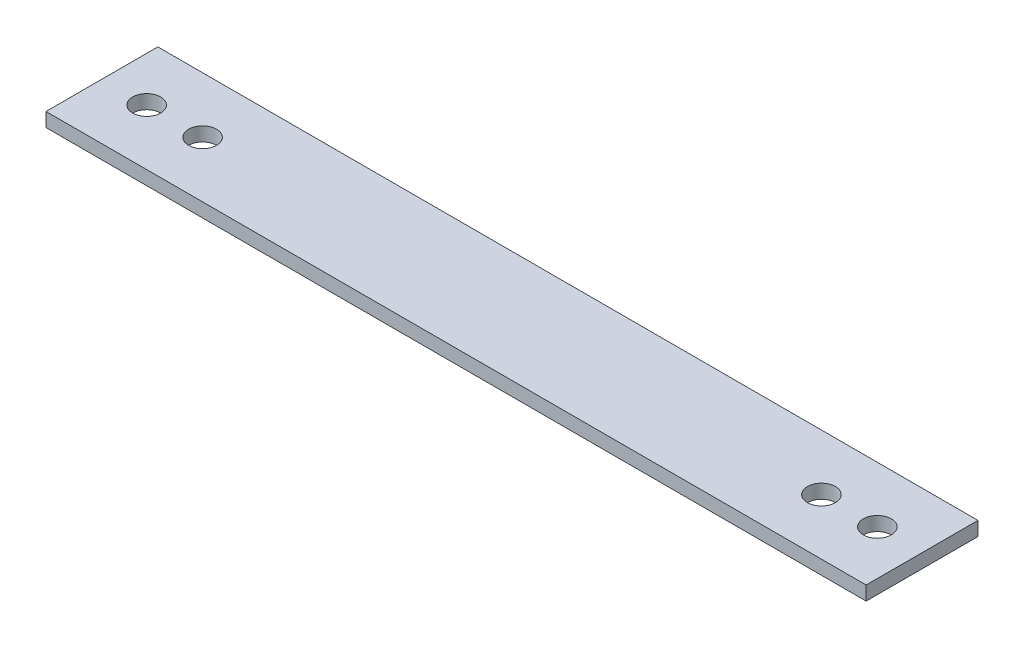
ISO-10303-21;
HEADER;
FILE_DESCRIPTION(('STEP AP214'),'2;1');
FILE_NAME('part.step','',(''),(''),'','','');
FILE_SCHEMA(('AUTOMOTIVE_DESIGN { 1 0 10303 214 1 1 1 1 }'));
ENDSEC;
DATA;
#1=APPLICATION_CONTEXT('core data for automotive mechanical design processes');
#2=APPLICATION_PROTOCOL_DEFINITION('international standard','automotive_design',2000,#1);
#3=PRODUCT_CONTEXT('',#1,'mechanical');
#4=PRODUCT('Part','Part','',(#3));
#5=PRODUCT_RELATED_PRODUCT_CATEGORY('part','',(#4));
#6=PRODUCT_DEFINITION_FORMATION('','',#4);
#7=PRODUCT_DEFINITION_CONTEXT('part definition',#1,'design');
#8=PRODUCT_DEFINITION('design','',#6,#7);
#9=PRODUCT_DEFINITION_SHAPE('','',#8);
#10=(LENGTH_UNIT() NAMED_UNIT(*) SI_UNIT(.MILLI.,.METRE.));
#11=(NAMED_UNIT(*) PLANE_ANGLE_UNIT() SI_UNIT($,.RADIAN.));
#12=(NAMED_UNIT(*) SI_UNIT($,.STERADIAN.) SOLID_ANGLE_UNIT());
#13=UNCERTAINTY_MEASURE_WITH_UNIT(LENGTH_MEASURE(1.E-05),#10,'distance_accuracy_value','');
#14=(GEOMETRIC_REPRESENTATION_CONTEXT(3) GLOBAL_UNCERTAINTY_ASSIGNED_CONTEXT((#13)) GLOBAL_UNIT_ASSIGNED_CONTEXT((#10,
#11,#12)) REPRESENTATION_CONTEXT('',''));
#15=CARTESIAN_POINT('',(0.,0.,0.));
#16=DIRECTION('',(0.,0.,1.));
#17=DIRECTION('',(1.,0.,0.));
#18=AXIS2_PLACEMENT_3D('',#15,#16,#17);
#19=CARTESIAN_POINT('',(0.,4.7625,0.));
#20=DIRECTION('',(0.,-1.,0.));
#21=DIRECTION('',(0.,0.,-1.));
#22=AXIS2_PLACEMENT_3D('',#19,#20,#21);
#23=PLANE('',#22);
#24=DIRECTION('',(0.,0.,-1.));
#25=VECTOR('',#24,1.);
#26=CARTESIAN_POINT('',(139.7,4.7625,19.05));
#27=LINE('',#26,#25);
#28=CARTESIAN_POINT('',(139.7,4.7625,19.05));
#29=VERTEX_POINT('',#28);
#30=CARTESIAN_POINT('',(139.7,4.7625,-19.05));
#31=VERTEX_POINT('',#30);
#32=EDGE_CURVE('E95',#29,#31,#27,.T.);
#33=ORIENTED_EDGE('',*,*,#32,.T.);
#34=DIRECTION('',(-1.,0.,0.));
#35=VECTOR('',#34,1.);
#36=CARTESIAN_POINT('',(-139.7,4.7625,-19.05));
#37=LINE('',#36,#35);
#38=CARTESIAN_POINT('',(-139.7,4.7625,-19.05));
#39=VERTEX_POINT('',#38);
#40=EDGE_CURVE('E90',#31,#39,#37,.T.);
#41=ORIENTED_EDGE('',*,*,#40,.T.);
#42=DIRECTION('',(0.,0.,1.));
#43=VECTOR('',#42,1.);
#44=CARTESIAN_POINT('',(-139.7,4.7625,19.05));
#45=LINE('',#44,#43);
#46=CARTESIAN_POINT('',(-139.7,4.7625,19.05));
#47=VERTEX_POINT('',#46);
#48=EDGE_CURVE('E93',#39,#47,#45,.T.);
#49=ORIENTED_EDGE('',*,*,#48,.T.);
#50=DIRECTION('',(1.,0.,0.));
#51=VECTOR('',#50,1.);
#52=CARTESIAN_POINT('',(-139.7,4.7625,19.05));
#53=LINE('',#52,#51);
#54=EDGE_CURVE('E60',#47,#29,#53,.T.);
#55=ORIENTED_EDGE('',*,*,#54,.T.);
#56=EDGE_LOOP('',(#33,#41,#49,#55));
#57=FACE_BOUND('',#56,.T.);
#58=CARTESIAN_POINT('',(-124.46,4.7625,0.));
#59=DIRECTION('',(0.,1.,0.));
#60=DIRECTION('',(0.,0.,1.));
#61=AXIS2_PLACEMENT_3D('',#58,#59,#60);
#62=CIRCLE('',#61,4.7625);
#63=CARTESIAN_POINT('',(-124.46,4.7625,-4.7625));
#64=VERTEX_POINT('',#63);
#65=EDGE_CURVE('E115',#64,#64,#62,.T.);
#66=ORIENTED_EDGE('',*,*,#65,.F.);
#67=EDGE_LOOP('',(#66));
#68=FACE_BOUND('',#67,.T.);
#69=CARTESIAN_POINT('',(-105.41,4.7625,0.));
#70=DIRECTION('',(0.,1.,0.));
#71=DIRECTION('',(0.,0.,1.));
#72=AXIS2_PLACEMENT_3D('',#69,#70,#71);
#73=CIRCLE('',#72,4.7625);
#74=CARTESIAN_POINT('',(-105.41,4.7625,-4.7625));
#75=VERTEX_POINT('',#74);
#76=EDGE_CURVE('E137',#75,#75,#73,.T.);
#77=ORIENTED_EDGE('',*,*,#76,.F.);
#78=EDGE_LOOP('',(#77));
#79=FACE_BOUND('',#78,.T.);
#80=CARTESIAN_POINT('',(124.46,4.7625,0.));
#81=DIRECTION('',(0.,1.,0.));
#82=DIRECTION('',(0.,0.,-1.));
#83=AXIS2_PLACEMENT_3D('',#80,#81,#82);
#84=CIRCLE('',#83,4.76250000000001);
#85=CARTESIAN_POINT('',(124.46,4.7625,-4.76250000000004));
#86=VERTEX_POINT('',#85);
#87=EDGE_CURVE('E145',#86,#86,#84,.T.);
#88=ORIENTED_EDGE('',*,*,#87,.F.);
#89=EDGE_LOOP('',(#88));
#90=FACE_BOUND('',#89,.T.);
#91=CARTESIAN_POINT('',(105.41,4.7625,0.));
#92=DIRECTION('',(0.,1.,0.));
#93=DIRECTION('',(0.,0.,-1.));
#94=AXIS2_PLACEMENT_3D('',#91,#92,#93);
#95=CIRCLE('',#94,4.7625);
#96=CARTESIAN_POINT('',(105.41,4.7625,-4.76250000000002));
#97=VERTEX_POINT('',#96);
#98=EDGE_CURVE('E153',#97,#97,#95,.T.);
#99=ORIENTED_EDGE('',*,*,#98,.F.);
#100=EDGE_LOOP('',(#99));
#101=FACE_BOUND('',#100,.T.);
#102=ADVANCED_FACE('F42',(#57,#68,#79,#90,#101),#23,.F.);
#103=CARTESIAN_POINT('',(0.,0.,0.));
#104=DIRECTION('',(0.,-1.,0.));
#105=DIRECTION('',(0.,0.,-1.));
#106=AXIS2_PLACEMENT_3D('',#103,#104,#105);
#107=PLANE('',#106);
#108=CARTESIAN_POINT('',(124.46,0.,0.));
#109=DIRECTION('',(0.,1.,0.));
#110=DIRECTION('',(0.,0.,-1.));
#111=AXIS2_PLACEMENT_3D('',#108,#109,#110);
#112=CIRCLE('',#111,4.76250000000001);
#113=CARTESIAN_POINT('',(124.46,0.,-4.76250000000004));
#114=VERTEX_POINT('',#113);
#115=EDGE_CURVE('E149',#114,#114,#112,.T.);
#116=ORIENTED_EDGE('',*,*,#115,.T.);
#117=EDGE_LOOP('',(#116));
#118=FACE_BOUND('',#117,.T.);
#119=CARTESIAN_POINT('',(-124.46,0.,0.));
#120=DIRECTION('',(0.,1.,0.));
#121=DIRECTION('',(0.,0.,1.));
#122=AXIS2_PLACEMENT_3D('',#119,#120,#121);
#123=CIRCLE('',#122,4.7625);
#124=CARTESIAN_POINT('',(-124.46,0.,-4.7625));
#125=VERTEX_POINT('',#124);
#126=EDGE_CURVE('E133',#125,#125,#123,.T.);
#127=ORIENTED_EDGE('',*,*,#126,.T.);
#128=EDGE_LOOP('',(#127));
#129=FACE_BOUND('',#128,.T.);
#130=DIRECTION('',(0.,0.,-1.));
#131=VECTOR('',#130,1.);
#132=CARTESIAN_POINT('',(139.7,0.,19.05));
#133=LINE('',#132,#131);
#134=CARTESIAN_POINT('',(139.7,0.,19.05));
#135=VERTEX_POINT('',#134);
#136=CARTESIAN_POINT('',(139.7,0.,-19.05));
#137=VERTEX_POINT('',#136);
#138=EDGE_CURVE('E111',#135,#137,#133,.T.);
#139=ORIENTED_EDGE('',*,*,#138,.F.);
#140=DIRECTION('',(1.,0.,0.));
#141=VECTOR('',#140,1.);
#142=CARTESIAN_POINT('',(-139.7,0.,19.05));
#143=LINE('',#142,#141);
#144=CARTESIAN_POINT('',(-139.7,0.,19.05));
#145=VERTEX_POINT('',#144);
#146=EDGE_CURVE('E83',#145,#135,#143,.T.);
#147=ORIENTED_EDGE('',*,*,#146,.F.);
#148=DIRECTION('',(0.,0.,1.));
#149=VECTOR('',#148,1.);
#150=CARTESIAN_POINT('',(-139.7,0.,19.05));
#151=LINE('',#150,#149);
#152=CARTESIAN_POINT('',(-139.7,0.,-19.05));
#153=VERTEX_POINT('',#152);
#154=EDGE_CURVE('E77',#153,#145,#151,.T.);
#155=ORIENTED_EDGE('',*,*,#154,.F.);
#156=DIRECTION('',(-1.,0.,0.));
#157=VECTOR('',#156,1.);
#158=CARTESIAN_POINT('',(-139.7,0.,-19.05));
#159=LINE('',#158,#157);
#160=EDGE_CURVE('E100',#137,#153,#159,.T.);
#161=ORIENTED_EDGE('',*,*,#160,.F.);
#162=EDGE_LOOP('',(#139,#147,#155,#161));
#163=FACE_BOUND('',#162,.T.);
#164=CARTESIAN_POINT('',(-105.41,0.,0.));
#165=DIRECTION('',(0.,1.,0.));
#166=DIRECTION('',(0.,0.,1.));
#167=AXIS2_PLACEMENT_3D('',#164,#165,#166);
#168=CIRCLE('',#167,4.7625);
#169=CARTESIAN_POINT('',(-105.41,0.,-4.7625));
#170=VERTEX_POINT('',#169);
#171=EDGE_CURVE('E141',#170,#170,#168,.T.);
#172=ORIENTED_EDGE('',*,*,#171,.T.);
#173=EDGE_LOOP('',(#172));
#174=FACE_BOUND('',#173,.T.);
#175=CARTESIAN_POINT('',(105.41,0.,0.));
#176=DIRECTION('',(0.,1.,0.));
#177=DIRECTION('',(0.,0.,-1.));
#178=AXIS2_PLACEMENT_3D('',#175,#176,#177);
#179=CIRCLE('',#178,4.7625);
#180=CARTESIAN_POINT('',(105.41,0.,-4.76250000000002));
#181=VERTEX_POINT('',#180);
#182=EDGE_CURVE('E157',#181,#181,#179,.T.);
#183=ORIENTED_EDGE('',*,*,#182,.T.);
#184=EDGE_LOOP('',(#183));
#185=FACE_BOUND('',#184,.T.);
#186=ADVANCED_FACE('F128',(#118,#129,#163,#174,#185),#107,.T.);
#187=CARTESIAN_POINT('',(139.7,4.7625,19.05));
#188=DIRECTION('',(-1.,0.,0.));
#189=DIRECTION('',(0.,0.,1.));
#190=AXIS2_PLACEMENT_3D('',#187,#188,#189);
#191=PLANE('',#190);
#192=ORIENTED_EDGE('',*,*,#138,.T.);
#193=DIRECTION('',(0.,-1.,0.));
#194=VECTOR('',#193,1.);
#195=CARTESIAN_POINT('',(139.7,4.7625,-19.05));
#196=LINE('',#195,#194);
#197=EDGE_CURVE('E11',#31,#137,#196,.T.);
#198=ORIENTED_EDGE('',*,*,#197,.F.);
#199=ORIENTED_EDGE('',*,*,#32,.F.);
#200=DIRECTION('',(0.,-1.,0.));
#201=VECTOR('',#200,1.);
#202=CARTESIAN_POINT('',(139.7,4.7625,19.05));
#203=LINE('',#202,#201);
#204=EDGE_CURVE('E107',#29,#135,#203,.T.);
#205=ORIENTED_EDGE('',*,*,#204,.T.);
#206=EDGE_LOOP('',(#192,#198,#199,#205));
#207=FACE_BOUND('',#206,.T.);
#208=ADVANCED_FACE('F44',(#207),#191,.F.);
#209=CARTESIAN_POINT('',(-139.7,4.7625,-19.05));
#210=DIRECTION('',(0.,0.,1.));
#211=DIRECTION('',(1.,0.,0.));
#212=AXIS2_PLACEMENT_3D('',#209,#210,#211);
#213=PLANE('',#212);
#214=ORIENTED_EDGE('',*,*,#160,.T.);
#215=DIRECTION('',(0.,-1.,0.));
#216=VECTOR('',#215,1.);
#217=CARTESIAN_POINT('',(-139.7,4.7625,-19.05));
#218=LINE('',#217,#216);
#219=EDGE_CURVE('E52',#39,#153,#218,.T.);
#220=ORIENTED_EDGE('',*,*,#219,.F.);
#221=ORIENTED_EDGE('',*,*,#40,.F.);
#222=ORIENTED_EDGE('',*,*,#197,.T.);
#223=EDGE_LOOP('',(#214,#220,#221,#222));
#224=FACE_BOUND('',#223,.T.);
#225=ADVANCED_FACE('F99',(#224),#213,.F.);
#226=CARTESIAN_POINT('',(-139.7,4.7625,19.05));
#227=DIRECTION('',(1.,0.,0.));
#228=DIRECTION('',(0.,0.,-1.));
#229=AXIS2_PLACEMENT_3D('',#226,#227,#228);
#230=PLANE('',#229);
#231=ORIENTED_EDGE('',*,*,#154,.T.);
#232=DIRECTION('',(0.,-1.,0.));
#233=VECTOR('',#232,1.);
#234=CARTESIAN_POINT('',(-139.7,4.7625,19.05));
#235=LINE('',#234,#233);
#236=EDGE_CURVE('E102',#47,#145,#235,.T.);
#237=ORIENTED_EDGE('',*,*,#236,.F.);
#238=ORIENTED_EDGE('',*,*,#48,.F.);
#239=ORIENTED_EDGE('',*,*,#219,.T.);
#240=EDGE_LOOP('',(#231,#237,#238,#239));
#241=FACE_BOUND('',#240,.T.);
#242=ADVANCED_FACE('F103',(#241),#230,.F.);
#243=CARTESIAN_POINT('',(-139.7,4.7625,19.05));
#244=DIRECTION('',(0.,0.,-1.));
#245=DIRECTION('',(-1.,0.,0.));
#246=AXIS2_PLACEMENT_3D('',#243,#244,#245);
#247=PLANE('',#246);
#248=ORIENTED_EDGE('',*,*,#146,.T.);
#249=ORIENTED_EDGE('',*,*,#204,.F.);
#250=ORIENTED_EDGE('',*,*,#54,.F.);
#251=ORIENTED_EDGE('',*,*,#236,.T.);
#252=EDGE_LOOP('',(#248,#249,#250,#251));
#253=FACE_BOUND('',#252,.T.);
#254=ADVANCED_FACE('F125',(#253),#247,.F.);
#255=CARTESIAN_POINT('',(-124.46,4.7625,0.));
#256=DIRECTION('',(0.,-1.,0.));
#257=DIRECTION('',(0.,0.,-1.));
#258=AXIS2_PLACEMENT_3D('',#255,#256,#257);
#259=CYLINDRICAL_SURFACE('',#258,4.7625);
#260=CARTESIAN_POINT('',(-124.46,4.7625,-4.7625));
#261=CARTESIAN_POINT('',(-124.46,4.712890625,-4.7625));
#262=CARTESIAN_POINT('',(-124.46,4.66328125,-4.7625));
#263=CARTESIAN_POINT('',(-124.46,4.5640625,-4.7625));
#264=CARTESIAN_POINT('',(-124.46,4.514453125,-4.7625));
#265=CARTESIAN_POINT('',(-124.46,4.415234375,-4.7625));
#266=CARTESIAN_POINT('',(-124.46,4.365625,-4.7625));
#267=CARTESIAN_POINT('',(-124.46,4.26640625,-4.7625));
#268=CARTESIAN_POINT('',(-124.46,4.216796875,-4.7625));
#269=CARTESIAN_POINT('',(-124.46,4.117578125,-4.7625));
#270=CARTESIAN_POINT('',(-124.46,4.06796875,-4.7625));
#271=CARTESIAN_POINT('',(-124.46,3.96875,-4.7625));
#272=CARTESIAN_POINT('',(-124.46,3.919140625,-4.7625));
#273=CARTESIAN_POINT('',(-124.46,3.819921875,-4.7625));
#274=CARTESIAN_POINT('',(-124.46,3.7703125,-4.7625));
#275=CARTESIAN_POINT('',(-124.46,3.67109375,-4.7625));
#276=CARTESIAN_POINT('',(-124.46,3.621484375,-4.7625));
#277=CARTESIAN_POINT('',(-124.46,3.522265625,-4.7625));
#278=CARTESIAN_POINT('',(-124.46,3.47265625,-4.7625));
#279=CARTESIAN_POINT('',(-124.46,3.3734375,-4.7625));
#280=CARTESIAN_POINT('',(-124.46,3.323828125,-4.7625));
#281=CARTESIAN_POINT('',(-124.46,3.224609375,-4.7625));
#282=CARTESIAN_POINT('',(-124.46,3.175,-4.7625));
#283=CARTESIAN_POINT('',(-124.46,3.07578125,-4.7625));
#284=CARTESIAN_POINT('',(-124.46,3.026171875,-4.7625));
#285=CARTESIAN_POINT('',(-124.46,2.926953125,-4.7625));
#286=CARTESIAN_POINT('',(-124.46,2.87734375,-4.7625));
#287=CARTESIAN_POINT('',(-124.46,2.778125,-4.7625));
#288=CARTESIAN_POINT('',(-124.46,2.728515625,-4.7625));
#289=CARTESIAN_POINT('',(-124.46,2.629296875,-4.7625));
#290=CARTESIAN_POINT('',(-124.46,2.5796875,-4.7625));
#291=CARTESIAN_POINT('',(-124.46,2.48046875,-4.7625));
#292=CARTESIAN_POINT('',(-124.46,2.430859375,-4.7625));
#293=CARTESIAN_POINT('',(-124.46,2.331640625,-4.7625));
#294=CARTESIAN_POINT('',(-124.46,2.28203125,-4.7625));
#295=CARTESIAN_POINT('',(-124.46,2.1828125,-4.7625));
#296=CARTESIAN_POINT('',(-124.46,2.133203125,-4.7625));
#297=CARTESIAN_POINT('',(-124.46,2.033984375,-4.7625));
#298=CARTESIAN_POINT('',(-124.46,1.984375,-4.7625));
#299=CARTESIAN_POINT('',(-124.46,1.88515625,-4.7625));
#300=CARTESIAN_POINT('',(-124.46,1.835546875,-4.7625));
#301=CARTESIAN_POINT('',(-124.46,1.736328125,-4.7625));
#302=CARTESIAN_POINT('',(-124.46,1.68671875,-4.7625));
#303=CARTESIAN_POINT('',(-124.46,1.5875,-4.7625));
#304=CARTESIAN_POINT('',(-124.46,1.537890625,-4.7625));
#305=CARTESIAN_POINT('',(-124.46,1.438671875,-4.7625));
#306=CARTESIAN_POINT('',(-124.46,1.3890625,-4.7625));
#307=CARTESIAN_POINT('',(-124.46,1.28984375,-4.7625));
#308=CARTESIAN_POINT('',(-124.46,1.240234375,-4.7625));
#309=CARTESIAN_POINT('',(-124.46,1.141015625,-4.7625));
#310=CARTESIAN_POINT('',(-124.46,1.09140625,-4.7625));
#311=CARTESIAN_POINT('',(-124.46,0.992187499999999,-4.7625));
#312=CARTESIAN_POINT('',(-124.46,0.942578124999999,-4.7625));
#313=CARTESIAN_POINT('',(-124.46,0.843359375,-4.7625));
#314=CARTESIAN_POINT('',(-124.46,0.79375,-4.7625));
#315=CARTESIAN_POINT('',(-124.46,0.69453125,-4.7625));
#316=CARTESIAN_POINT('',(-124.46,0.644921875,-4.7625));
#317=CARTESIAN_POINT('',(-124.46,0.545703125,-4.7625));
#318=CARTESIAN_POINT('',(-124.46,0.49609375,-4.7625));
#319=CARTESIAN_POINT('',(-124.46,0.396875,-4.7625));
#320=CARTESIAN_POINT('',(-124.46,0.347265625,-4.7625));
#321=CARTESIAN_POINT('',(-124.46,0.248046875,-4.7625));
#322=CARTESIAN_POINT('',(-124.46,0.1984375,-4.7625));
#323=CARTESIAN_POINT('',(-124.46,0.09921875,-4.7625));
#324=CARTESIAN_POINT('',(-124.46,0.049609375,-4.7625));
#325=CARTESIAN_POINT('',(-124.46,0.,-4.7625));
#326=B_SPLINE_CURVE_WITH_KNOTS('',3,(#260,#261,#262,#263,#264,#265,#266,#267,#268,#269,#270,
#271,#272,#273,#274,#275,#276,#277,#278,#279,#280,#281,#282,#283,#284,#285,#286,#287,#288,#289,
#290,#291,#292,#293,#294,#295,#296,#297,#298,#299,#300,#301,#302,#303,#304,#305,#306,#307,#308,
#309,#310,#311,#312,#313,#314,#315,#316,#317,#318,#319,#320,#321,#322,#323,#324,#325),
.UNSPECIFIED.,.F.,.F.,(4,2,2,2,2,2,2,2,2,2,2,2,2,2,2,2,2,2,2,2,2,2,2,2,2,2,2,2,2,2,2,2,4),(0.,
0.148828125,0.29765625,0.446484375,0.5953125,0.744140625,0.892968750000001,1.041796875,1.190625,
1.339453125,1.48828125,1.637109375,1.7859375,1.934765625,2.08359375,2.232421875,2.38125,
2.530078125,2.67890625,2.827734375,2.9765625,3.125390625,3.27421875,3.423046875,3.571875,
3.720703125,3.86953125,4.018359375,4.1671875,4.316015625,4.46484375,4.613671875,4.7625),.UNSPECIFIED.);
#327=EDGE_CURVE('BSEAM176',#64,#125,#326,.T.);
#328=ORIENTED_EDGE('',*,*,#65,.T.);
#329=ORIENTED_EDGE('',*,*,#126,.F.);
#330=ORIENTED_EDGE('',*,*,#327,.T.);
#331=ORIENTED_EDGE('',*,*,#327,.F.);
#332=EDGE_LOOP('',(#328,#330,#329,#331));
#333=FACE_BOUND('',#332,.T.);
#334=ADVANCED_FACE('F176',(#333),#259,.F.);
#335=CARTESIAN_POINT('',(-105.41,4.7625,0.));
#336=DIRECTION('',(0.,-1.,0.));
#337=DIRECTION('',(0.,0.,-1.));
#338=AXIS2_PLACEMENT_3D('',#335,#336,#337);
#339=CYLINDRICAL_SURFACE('',#338,4.7625);
#340=CARTESIAN_POINT('',(-105.41,4.7625,-4.7625));
#341=CARTESIAN_POINT('',(-105.41,4.712890625,-4.7625));
#342=CARTESIAN_POINT('',(-105.41,4.66328125,-4.7625));
#343=CARTESIAN_POINT('',(-105.41,4.5640625,-4.7625));
#344=CARTESIAN_POINT('',(-105.41,4.514453125,-4.7625));
#345=CARTESIAN_POINT('',(-105.41,4.415234375,-4.7625));
#346=CARTESIAN_POINT('',(-105.41,4.365625,-4.7625));
#347=CARTESIAN_POINT('',(-105.41,4.26640625,-4.7625));
#348=CARTESIAN_POINT('',(-105.41,4.216796875,-4.7625));
#349=CARTESIAN_POINT('',(-105.41,4.117578125,-4.7625));
#350=CARTESIAN_POINT('',(-105.41,4.06796875,-4.7625));
#351=CARTESIAN_POINT('',(-105.41,3.96875,-4.7625));
#352=CARTESIAN_POINT('',(-105.41,3.919140625,-4.7625));
#353=CARTESIAN_POINT('',(-105.41,3.819921875,-4.7625));
#354=CARTESIAN_POINT('',(-105.41,3.7703125,-4.7625));
#355=CARTESIAN_POINT('',(-105.41,3.67109375,-4.7625));
#356=CARTESIAN_POINT('',(-105.41,3.621484375,-4.7625));
#357=CARTESIAN_POINT('',(-105.41,3.522265625,-4.7625));
#358=CARTESIAN_POINT('',(-105.41,3.47265625,-4.7625));
#359=CARTESIAN_POINT('',(-105.41,3.3734375,-4.7625));
#360=CARTESIAN_POINT('',(-105.41,3.323828125,-4.7625));
#361=CARTESIAN_POINT('',(-105.41,3.224609375,-4.7625));
#362=CARTESIAN_POINT('',(-105.41,3.175,-4.7625));
#363=CARTESIAN_POINT('',(-105.41,3.07578125,-4.7625));
#364=CARTESIAN_POINT('',(-105.41,3.026171875,-4.7625));
#365=CARTESIAN_POINT('',(-105.41,2.926953125,-4.7625));
#366=CARTESIAN_POINT('',(-105.41,2.87734375,-4.7625));
#367=CARTESIAN_POINT('',(-105.41,2.778125,-4.7625));
#368=CARTESIAN_POINT('',(-105.41,2.728515625,-4.7625));
#369=CARTESIAN_POINT('',(-105.41,2.629296875,-4.7625));
#370=CARTESIAN_POINT('',(-105.41,2.5796875,-4.7625));
#371=CARTESIAN_POINT('',(-105.41,2.48046875,-4.7625));
#372=CARTESIAN_POINT('',(-105.41,2.430859375,-4.7625));
#373=CARTESIAN_POINT('',(-105.41,2.331640625,-4.7625));
#374=CARTESIAN_POINT('',(-105.41,2.28203125,-4.7625));
#375=CARTESIAN_POINT('',(-105.41,2.1828125,-4.7625));
#376=CARTESIAN_POINT('',(-105.41,2.133203125,-4.7625));
#377=CARTESIAN_POINT('',(-105.41,2.033984375,-4.7625));
#378=CARTESIAN_POINT('',(-105.41,1.984375,-4.7625));
#379=CARTESIAN_POINT('',(-105.41,1.88515625,-4.7625));
#380=CARTESIAN_POINT('',(-105.41,1.835546875,-4.7625));
#381=CARTESIAN_POINT('',(-105.41,1.736328125,-4.7625));
#382=CARTESIAN_POINT('',(-105.41,1.68671875,-4.7625));
#383=CARTESIAN_POINT('',(-105.41,1.5875,-4.7625));
#384=CARTESIAN_POINT('',(-105.41,1.537890625,-4.7625));
#385=CARTESIAN_POINT('',(-105.41,1.438671875,-4.7625));
#386=CARTESIAN_POINT('',(-105.41,1.3890625,-4.7625));
#387=CARTESIAN_POINT('',(-105.41,1.28984375,-4.7625));
#388=CARTESIAN_POINT('',(-105.41,1.240234375,-4.7625));
#389=CARTESIAN_POINT('',(-105.41,1.141015625,-4.7625));
#390=CARTESIAN_POINT('',(-105.41,1.09140625,-4.7625));
#391=CARTESIAN_POINT('',(-105.41,0.992187499999999,-4.7625));
#392=CARTESIAN_POINT('',(-105.41,0.942578124999999,-4.7625));
#393=CARTESIAN_POINT('',(-105.41,0.843359375,-4.7625));
#394=CARTESIAN_POINT('',(-105.41,0.79375,-4.7625));
#395=CARTESIAN_POINT('',(-105.41,0.69453125,-4.7625));
#396=CARTESIAN_POINT('',(-105.41,0.644921875,-4.7625));
#397=CARTESIAN_POINT('',(-105.41,0.545703125,-4.7625));
#398=CARTESIAN_POINT('',(-105.41,0.49609375,-4.7625));
#399=CARTESIAN_POINT('',(-105.41,0.396875,-4.7625));
#400=CARTESIAN_POINT('',(-105.41,0.347265625,-4.7625));
#401=CARTESIAN_POINT('',(-105.41,0.248046875,-4.7625));
#402=CARTESIAN_POINT('',(-105.41,0.1984375,-4.7625));
#403=CARTESIAN_POINT('',(-105.41,0.09921875,-4.7625));
#404=CARTESIAN_POINT('',(-105.41,0.049609375,-4.7625));
#405=CARTESIAN_POINT('',(-105.41,0.,-4.7625));
#406=B_SPLINE_CURVE_WITH_KNOTS('',3,(#340,#341,#342,#343,#344,#345,#346,#347,#348,#349,#350,
#351,#352,#353,#354,#355,#356,#357,#358,#359,#360,#361,#362,#363,#364,#365,#366,#367,#368,#369,
#370,#371,#372,#373,#374,#375,#376,#377,#378,#379,#380,#381,#382,#383,#384,#385,#386,#387,#388,
#389,#390,#391,#392,#393,#394,#395,#396,#397,#398,#399,#400,#401,#402,#403,#404,#405),
.UNSPECIFIED.,.F.,.F.,(4,2,2,2,2,2,2,2,2,2,2,2,2,2,2,2,2,2,2,2,2,2,2,2,2,2,2,2,2,2,2,2,4),(0.,
0.148828125,0.29765625,0.446484375,0.5953125,0.744140625,0.892968750000001,1.041796875,1.190625,
1.339453125,1.48828125,1.637109375,1.7859375,1.934765625,2.08359375,2.232421875,2.38125,
2.530078125,2.67890625,2.827734375,2.9765625,3.125390625,3.27421875,3.423046875,3.571875,
3.720703125,3.86953125,4.018359375,4.1671875,4.316015625,4.46484375,4.613671875,4.7625),.UNSPECIFIED.);
#407=EDGE_CURVE('BSEAM230',#75,#170,#406,.T.);
#408=ORIENTED_EDGE('',*,*,#76,.T.);
#409=ORIENTED_EDGE('',*,*,#171,.F.);
#410=ORIENTED_EDGE('',*,*,#407,.T.);
#411=ORIENTED_EDGE('',*,*,#407,.F.);
#412=EDGE_LOOP('',(#408,#410,#409,#411));
#413=FACE_BOUND('',#412,.T.);
#414=ADVANCED_FACE('F230',(#413),#339,.F.);
#415=CARTESIAN_POINT('',(124.46,4.7625,0.));
#416=DIRECTION('',(0.,-1.,0.));
#417=DIRECTION('',(0.,0.,-1.));
#418=AXIS2_PLACEMENT_3D('',#415,#416,#417);
#419=CYLINDRICAL_SURFACE('',#418,4.76250000000001);
#420=CARTESIAN_POINT('',(124.46,4.7625,-4.76250000000004));
#421=CARTESIAN_POINT('',(124.46,4.712890625,-4.76250000000004));
#422=CARTESIAN_POINT('',(124.46,4.66328125,-4.76250000000004));
#423=CARTESIAN_POINT('',(124.46,4.5640625,-4.76250000000004));
#424=CARTESIAN_POINT('',(124.46,4.514453125,-4.76250000000004));
#425=CARTESIAN_POINT('',(124.46,4.415234375,-4.76250000000004));
#426=CARTESIAN_POINT('',(124.46,4.365625,-4.76250000000004));
#427=CARTESIAN_POINT('',(124.46,4.26640625,-4.76250000000004));
#428=CARTESIAN_POINT('',(124.46,4.216796875,-4.76250000000004));
#429=CARTESIAN_POINT('',(124.46,4.117578125,-4.76250000000004));
#430=CARTESIAN_POINT('',(124.46,4.06796875,-4.76250000000004));
#431=CARTESIAN_POINT('',(124.46,3.96875,-4.76250000000004));
#432=CARTESIAN_POINT('',(124.46,3.919140625,-4.76250000000004));
#433=CARTESIAN_POINT('',(124.46,3.819921875,-4.76250000000004));
#434=CARTESIAN_POINT('',(124.46,3.7703125,-4.76250000000004));
#435=CARTESIAN_POINT('',(124.46,3.67109375,-4.76250000000004));
#436=CARTESIAN_POINT('',(124.46,3.621484375,-4.76250000000004));
#437=CARTESIAN_POINT('',(124.46,3.522265625,-4.76250000000004));
#438=CARTESIAN_POINT('',(124.46,3.47265625,-4.76250000000004));
#439=CARTESIAN_POINT('',(124.46,3.3734375,-4.76250000000004));
#440=CARTESIAN_POINT('',(124.46,3.323828125,-4.76250000000004));
#441=CARTESIAN_POINT('',(124.46,3.224609375,-4.76250000000004));
#442=CARTESIAN_POINT('',(124.46,3.175,-4.76250000000004));
#443=CARTESIAN_POINT('',(124.46,3.07578125,-4.76250000000004));
#444=CARTESIAN_POINT('',(124.46,3.026171875,-4.76250000000004));
#445=CARTESIAN_POINT('',(124.46,2.926953125,-4.76250000000004));
#446=CARTESIAN_POINT('',(124.46,2.87734375,-4.76250000000004));
#447=CARTESIAN_POINT('',(124.46,2.778125,-4.76250000000004));
#448=CARTESIAN_POINT('',(124.46,2.728515625,-4.76250000000004));
#449=CARTESIAN_POINT('',(124.46,2.629296875,-4.76250000000004));
#450=CARTESIAN_POINT('',(124.46,2.5796875,-4.76250000000004));
#451=CARTESIAN_POINT('',(124.46,2.48046875,-4.76250000000004));
#452=CARTESIAN_POINT('',(124.46,2.430859375,-4.76250000000004));
#453=CARTESIAN_POINT('',(124.46,2.331640625,-4.76250000000004));
#454=CARTESIAN_POINT('',(124.46,2.28203125,-4.76250000000004));
#455=CARTESIAN_POINT('',(124.46,2.1828125,-4.76250000000004));
#456=CARTESIAN_POINT('',(124.46,2.133203125,-4.76250000000004));
#457=CARTESIAN_POINT('',(124.46,2.033984375,-4.76250000000004));
#458=CARTESIAN_POINT('',(124.46,1.984375,-4.76250000000004));
#459=CARTESIAN_POINT('',(124.46,1.88515625,-4.76250000000004));
#460=CARTESIAN_POINT('',(124.46,1.835546875,-4.76250000000004));
#461=CARTESIAN_POINT('',(124.46,1.736328125,-4.76250000000004));
#462=CARTESIAN_POINT('',(124.46,1.68671875,-4.76250000000004));
#463=CARTESIAN_POINT('',(124.46,1.5875,-4.76250000000004));
#464=CARTESIAN_POINT('',(124.46,1.537890625,-4.76250000000004));
#465=CARTESIAN_POINT('',(124.46,1.438671875,-4.76250000000004));
#466=CARTESIAN_POINT('',(124.46,1.3890625,-4.76250000000004));
#467=CARTESIAN_POINT('',(124.46,1.28984375,-4.76250000000004));
#468=CARTESIAN_POINT('',(124.46,1.240234375,-4.76250000000004));
#469=CARTESIAN_POINT('',(124.46,1.141015625,-4.76250000000004));
#470=CARTESIAN_POINT('',(124.46,1.09140625,-4.76250000000004));
#471=CARTESIAN_POINT('',(124.46,0.992187499999999,-4.76250000000004));
#472=CARTESIAN_POINT('',(124.46,0.942578124999999,-4.76250000000004));
#473=CARTESIAN_POINT('',(124.46,0.843359375,-4.76250000000004));
#474=CARTESIAN_POINT('',(124.46,0.79375,-4.76250000000004));
#475=CARTESIAN_POINT('',(124.46,0.69453125,-4.76250000000004));
#476=CARTESIAN_POINT('',(124.46,0.644921875,-4.76250000000004));
#477=CARTESIAN_POINT('',(124.46,0.545703125,-4.76250000000004));
#478=CARTESIAN_POINT('',(124.46,0.49609375,-4.76250000000004));
#479=CARTESIAN_POINT('',(124.46,0.396875,-4.76250000000004));
#480=CARTESIAN_POINT('',(124.46,0.347265625,-4.76250000000004));
#481=CARTESIAN_POINT('',(124.46,0.248046875,-4.76250000000004));
#482=CARTESIAN_POINT('',(124.46,0.1984375,-4.76250000000004));
#483=CARTESIAN_POINT('',(124.46,0.09921875,-4.76250000000004));
#484=CARTESIAN_POINT('',(124.46,0.049609375,-4.76250000000004));
#485=CARTESIAN_POINT('',(124.46,0.,-4.76250000000004));
#486=B_SPLINE_CURVE_WITH_KNOTS('',3,(#420,#421,#422,#423,#424,#425,#426,#427,#428,#429,#430,
#431,#432,#433,#434,#435,#436,#437,#438,#439,#440,#441,#442,#443,#444,#445,#446,#447,#448,#449,
#450,#451,#452,#453,#454,#455,#456,#457,#458,#459,#460,#461,#462,#463,#464,#465,#466,#467,#468,
#469,#470,#471,#472,#473,#474,#475,#476,#477,#478,#479,#480,#481,#482,#483,#484,#485),
.UNSPECIFIED.,.F.,.F.,(4,2,2,2,2,2,2,2,2,2,2,2,2,2,2,2,2,2,2,2,2,2,2,2,2,2,2,2,2,2,2,2,4),(0.,
0.148828125,0.29765625,0.446484375,0.5953125,0.744140625,0.892968750000001,1.041796875,1.190625,
1.339453125,1.48828125,1.637109375,1.7859375,1.934765625,2.08359375,2.232421875,2.38125,
2.530078125,2.67890625,2.827734375,2.9765625,3.125390625,3.27421875,3.423046875,3.571875,
3.720703125,3.86953125,4.018359375,4.1671875,4.316015625,4.46484375,4.613671875,4.7625),.UNSPECIFIED.);
#487=EDGE_CURVE('BSEAM239',#86,#114,#486,.T.);
#488=ORIENTED_EDGE('',*,*,#87,.T.);
#489=ORIENTED_EDGE('',*,*,#115,.F.);
#490=ORIENTED_EDGE('',*,*,#487,.T.);
#491=ORIENTED_EDGE('',*,*,#487,.F.);
#492=EDGE_LOOP('',(#488,#490,#489,#491));
#493=FACE_BOUND('',#492,.T.);
#494=ADVANCED_FACE('F239',(#493),#419,.F.);
#495=CARTESIAN_POINT('',(105.41,4.7625,0.));
#496=DIRECTION('',(0.,-1.,0.));
#497=DIRECTION('',(0.,0.,-1.));
#498=AXIS2_PLACEMENT_3D('',#495,#496,#497);
#499=CYLINDRICAL_SURFACE('',#498,4.7625);
#500=CARTESIAN_POINT('',(105.41,4.7625,-4.76250000000002));
#501=CARTESIAN_POINT('',(105.41,4.712890625,-4.76250000000002));
#502=CARTESIAN_POINT('',(105.41,4.66328125,-4.76250000000002));
#503=CARTESIAN_POINT('',(105.41,4.5640625,-4.76250000000002));
#504=CARTESIAN_POINT('',(105.41,4.514453125,-4.76250000000002));
#505=CARTESIAN_POINT('',(105.41,4.415234375,-4.76250000000002));
#506=CARTESIAN_POINT('',(105.41,4.365625,-4.76250000000002));
#507=CARTESIAN_POINT('',(105.41,4.26640625,-4.76250000000002));
#508=CARTESIAN_POINT('',(105.41,4.216796875,-4.76250000000002));
#509=CARTESIAN_POINT('',(105.41,4.117578125,-4.76250000000002));
#510=CARTESIAN_POINT('',(105.41,4.06796875,-4.76250000000002));
#511=CARTESIAN_POINT('',(105.41,3.96875,-4.76250000000002));
#512=CARTESIAN_POINT('',(105.41,3.919140625,-4.76250000000002));
#513=CARTESIAN_POINT('',(105.41,3.819921875,-4.76250000000002));
#514=CARTESIAN_POINT('',(105.41,3.7703125,-4.76250000000002));
#515=CARTESIAN_POINT('',(105.41,3.67109375,-4.76250000000002));
#516=CARTESIAN_POINT('',(105.41,3.621484375,-4.76250000000002));
#517=CARTESIAN_POINT('',(105.41,3.522265625,-4.76250000000002));
#518=CARTESIAN_POINT('',(105.41,3.47265625,-4.76250000000002));
#519=CARTESIAN_POINT('',(105.41,3.3734375,-4.76250000000002));
#520=CARTESIAN_POINT('',(105.41,3.323828125,-4.76250000000002));
#521=CARTESIAN_POINT('',(105.41,3.224609375,-4.76250000000002));
#522=CARTESIAN_POINT('',(105.41,3.175,-4.76250000000002));
#523=CARTESIAN_POINT('',(105.41,3.07578125,-4.76250000000002));
#524=CARTESIAN_POINT('',(105.41,3.026171875,-4.76250000000002));
#525=CARTESIAN_POINT('',(105.41,2.926953125,-4.76250000000002));
#526=CARTESIAN_POINT('',(105.41,2.87734375,-4.76250000000002));
#527=CARTESIAN_POINT('',(105.41,2.778125,-4.76250000000002));
#528=CARTESIAN_POINT('',(105.41,2.728515625,-4.76250000000002));
#529=CARTESIAN_POINT('',(105.41,2.629296875,-4.76250000000002));
#530=CARTESIAN_POINT('',(105.41,2.5796875,-4.76250000000002));
#531=CARTESIAN_POINT('',(105.41,2.48046875,-4.76250000000002));
#532=CARTESIAN_POINT('',(105.41,2.430859375,-4.76250000000002));
#533=CARTESIAN_POINT('',(105.41,2.331640625,-4.76250000000002));
#534=CARTESIAN_POINT('',(105.41,2.28203125,-4.76250000000002));
#535=CARTESIAN_POINT('',(105.41,2.1828125,-4.76250000000002));
#536=CARTESIAN_POINT('',(105.41,2.133203125,-4.76250000000002));
#537=CARTESIAN_POINT('',(105.41,2.033984375,-4.76250000000002));
#538=CARTESIAN_POINT('',(105.41,1.984375,-4.76250000000002));
#539=CARTESIAN_POINT('',(105.41,1.88515625,-4.76250000000002));
#540=CARTESIAN_POINT('',(105.41,1.835546875,-4.76250000000002));
#541=CARTESIAN_POINT('',(105.41,1.736328125,-4.76250000000002));
#542=CARTESIAN_POINT('',(105.41,1.68671875,-4.76250000000002));
#543=CARTESIAN_POINT('',(105.41,1.5875,-4.76250000000002));
#544=CARTESIAN_POINT('',(105.41,1.537890625,-4.76250000000002));
#545=CARTESIAN_POINT('',(105.41,1.438671875,-4.76250000000002));
#546=CARTESIAN_POINT('',(105.41,1.3890625,-4.76250000000002));
#547=CARTESIAN_POINT('',(105.41,1.28984375,-4.76250000000002));
#548=CARTESIAN_POINT('',(105.41,1.240234375,-4.76250000000002));
#549=CARTESIAN_POINT('',(105.41,1.141015625,-4.76250000000002));
#550=CARTESIAN_POINT('',(105.41,1.09140625,-4.76250000000002));
#551=CARTESIAN_POINT('',(105.41,0.992187499999999,-4.76250000000002));
#552=CARTESIAN_POINT('',(105.41,0.942578124999999,-4.76250000000002));
#553=CARTESIAN_POINT('',(105.41,0.843359375,-4.76250000000002));
#554=CARTESIAN_POINT('',(105.41,0.79375,-4.76250000000002));
#555=CARTESIAN_POINT('',(105.41,0.69453125,-4.76250000000002));
#556=CARTESIAN_POINT('',(105.41,0.644921875,-4.76250000000002));
#557=CARTESIAN_POINT('',(105.41,0.545703125,-4.76250000000002));
#558=CARTESIAN_POINT('',(105.41,0.49609375,-4.76250000000002));
#559=CARTESIAN_POINT('',(105.41,0.396875,-4.76250000000002));
#560=CARTESIAN_POINT('',(105.41,0.347265625,-4.76250000000002));
#561=CARTESIAN_POINT('',(105.41,0.248046875,-4.76250000000002));
#562=CARTESIAN_POINT('',(105.41,0.1984375,-4.76250000000002));
#563=CARTESIAN_POINT('',(105.41,0.09921875,-4.76250000000002));
#564=CARTESIAN_POINT('',(105.41,0.049609375,-4.76250000000002));
#565=CARTESIAN_POINT('',(105.41,0.,-4.76250000000002));
#566=B_SPLINE_CURVE_WITH_KNOTS('',3,(#500,#501,#502,#503,#504,#505,#506,#507,#508,#509,#510,
#511,#512,#513,#514,#515,#516,#517,#518,#519,#520,#521,#522,#523,#524,#525,#526,#527,#528,#529,
#530,#531,#532,#533,#534,#535,#536,#537,#538,#539,#540,#541,#542,#543,#544,#545,#546,#547,#548,
#549,#550,#551,#552,#553,#554,#555,#556,#557,#558,#559,#560,#561,#562,#563,#564,#565),
.UNSPECIFIED.,.F.,.F.,(4,2,2,2,2,2,2,2,2,2,2,2,2,2,2,2,2,2,2,2,2,2,2,2,2,2,2,2,2,2,2,2,4),(0.,
0.148828125,0.29765625,0.446484375,0.5953125,0.744140625,0.892968750000001,1.041796875,1.190625,
1.339453125,1.48828125,1.637109375,1.7859375,1.934765625,2.08359375,2.232421875,2.38125,
2.530078125,2.67890625,2.827734375,2.9765625,3.125390625,3.27421875,3.423046875,3.571875,
3.720703125,3.86953125,4.018359375,4.1671875,4.316015625,4.46484375,4.613671875,4.7625),.UNSPECIFIED.);
#567=EDGE_CURVE('BSEAM165',#97,#181,#566,.T.);
#568=ORIENTED_EDGE('',*,*,#98,.T.);
#569=ORIENTED_EDGE('',*,*,#182,.F.);
#570=ORIENTED_EDGE('',*,*,#567,.T.);
#571=ORIENTED_EDGE('',*,*,#567,.F.);
#572=EDGE_LOOP('',(#568,#570,#569,#571));
#573=FACE_BOUND('',#572,.T.);
#574=ADVANCED_FACE('F165',(#573),#499,.F.);
#575=CLOSED_SHELL('',(#102,#186,#208,#225,#242,#254,#334,#414,#494,#574));
#576=MANIFOLD_SOLID_BREP('B2',#575);
#577=ADVANCED_BREP_SHAPE_REPRESENTATION('',(#18,#576),#14);
#578=SHAPE_DEFINITION_REPRESENTATION(#9,#577);
ENDSEC;
END-ISO-10303-21;
